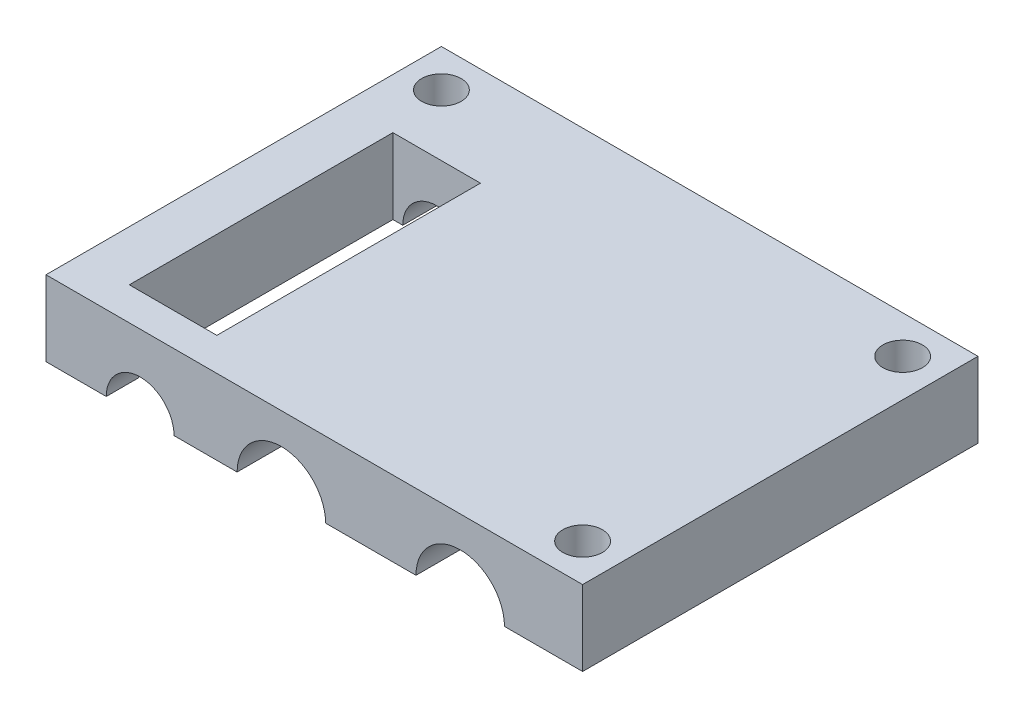
ISO-10303-21;
HEADER;
FILE_DESCRIPTION(('STEP AP214'),'2;1');
FILE_NAME('part.step','',(''),(''),'','','');
FILE_SCHEMA(('AUTOMOTIVE_DESIGN { 1 0 10303 214 1 1 1 1 }'));
ENDSEC;
DATA;
#1=APPLICATION_CONTEXT('core data for automotive mechanical design processes');
#2=APPLICATION_PROTOCOL_DEFINITION('international standard','automotive_design',2000,#1);
#3=PRODUCT_CONTEXT('',#1,'mechanical');
#4=PRODUCT('Part','Part','',(#3));
#5=PRODUCT_RELATED_PRODUCT_CATEGORY('part','',(#4));
#6=PRODUCT_DEFINITION_FORMATION('','',#4);
#7=PRODUCT_DEFINITION_CONTEXT('part definition',#1,'design');
#8=PRODUCT_DEFINITION('design','',#6,#7);
#9=PRODUCT_DEFINITION_SHAPE('','',#8);
#10=(LENGTH_UNIT() NAMED_UNIT(*) SI_UNIT(.MILLI.,.METRE.));
#11=(NAMED_UNIT(*) PLANE_ANGLE_UNIT() SI_UNIT($,.RADIAN.));
#12=(NAMED_UNIT(*) SI_UNIT($,.STERADIAN.) SOLID_ANGLE_UNIT());
#13=UNCERTAINTY_MEASURE_WITH_UNIT(LENGTH_MEASURE(1.E-05),#10,'distance_accuracy_value','');
#14=(GEOMETRIC_REPRESENTATION_CONTEXT(3) GLOBAL_UNCERTAINTY_ASSIGNED_CONTEXT((#13)) GLOBAL_UNIT_ASSIGNED_CONTEXT((#10,
#11,#12)) REPRESENTATION_CONTEXT('',''));
#15=CARTESIAN_POINT('',(0.,0.,0.));
#16=DIRECTION('',(0.,0.,1.));
#17=DIRECTION('',(1.,0.,0.));
#18=AXIS2_PLACEMENT_3D('',#15,#16,#17);
#19=CARTESIAN_POINT('',(-18.5,0.,-42.));
#20=DIRECTION('',(0.,0.,1.));
#21=DIRECTION('',(1.,0.,0.));
#22=AXIS2_PLACEMENT_3D('',#19,#20,#21);
#23=CYLINDRICAL_SURFACE('',#22,3.6);
#24=CARTESIAN_POINT('',(-18.5,0.,-39.));
#25=DIRECTION('',(0.,0.,-1.));
#26=DIRECTION('',(-1.,0.,0.));
#27=AXIS2_PLACEMENT_3D('',#24,#25,#26);
#28=CIRCLE('',#27,3.6);
#29=CARTESIAN_POINT('',(-14.9,0.,-39.));
#30=VERTEX_POINT('',#29);
#31=CARTESIAN_POINT('',(-22.1,0.,-39.));
#32=VERTEX_POINT('',#31);
#33=EDGE_CURVE('E221',#30,#32,#28,.F.);
#34=ORIENTED_EDGE('',*,*,#33,.F.);
#35=DIRECTION('',(0.,0.,1.));
#36=VECTOR('',#35,1.);
#37=CARTESIAN_POINT('',(-14.9,0.,-42.));
#38=LINE('',#37,#36);
#39=CARTESIAN_POINT('',(-14.9,0.,-31.5));
#40=VERTEX_POINT('',#39);
#41=EDGE_CURVE('E419',#30,#40,#38,.T.);
#42=ORIENTED_EDGE('',*,*,#41,.T.);
#43=CARTESIAN_POINT('',(-18.5,0.,-31.5));
#44=DIRECTION('',(0.,0.,-1.));
#45=DIRECTION('',(-1.,0.,0.));
#46=AXIS2_PLACEMENT_3D('',#43,#44,#45);
#47=CIRCLE('',#46,3.6);
#48=CARTESIAN_POINT('',(-22.1,0.,-31.5));
#49=VERTEX_POINT('',#48);
#50=EDGE_CURVE('E329',#40,#49,#47,.F.);
#51=ORIENTED_EDGE('',*,*,#50,.T.);
#52=DIRECTION('',(0.,0.,1.));
#53=VECTOR('',#52,1.);
#54=CARTESIAN_POINT('',(-22.1,0.,-42.));
#55=LINE('',#54,#53);
#56=EDGE_CURVE('E423',#32,#49,#55,.T.);
#57=ORIENTED_EDGE('',*,*,#56,.F.);
#58=EDGE_LOOP('',(#34,#42,#51,#57));
#59=FACE_BOUND('',#58,.T.);
#60=ADVANCED_FACE('F41',(#59),#23,.F.);
#61=CARTESIAN_POINT('',(-3.50000000000001,0.,-42.));
#62=DIRECTION('',(0.,0.,1.));
#63=DIRECTION('',(1.,0.,0.));
#64=AXIS2_PLACEMENT_3D('',#61,#62,#63);
#65=CYLINDRICAL_SURFACE('',#64,4.7);
#66=CARTESIAN_POINT('',(-3.50000000000001,0.,-39.));
#67=DIRECTION('',(0.,0.,-1.));
#68=DIRECTION('',(-1.,0.,0.));
#69=AXIS2_PLACEMENT_3D('',#66,#67,#68);
#70=CIRCLE('',#69,4.7);
#71=CARTESIAN_POINT('',(1.19999999999999,0.,-39.));
#72=VERTEX_POINT('',#71);
#73=CARTESIAN_POINT('',(-8.20000000000001,0.,-39.));
#74=VERTEX_POINT('',#73);
#75=EDGE_CURVE('E241',#72,#74,#70,.F.);
#76=ORIENTED_EDGE('',*,*,#75,.F.);
#77=DIRECTION('',(0.,0.,1.));
#78=VECTOR('',#77,1.);
#79=CARTESIAN_POINT('',(1.19999999999999,0.,-42.));
#80=LINE('',#79,#78);
#81=CARTESIAN_POINT('',(1.19999999999999,0.,0.));
#82=VERTEX_POINT('',#81);
#83=EDGE_CURVE('E51',#72,#82,#80,.T.);
#84=ORIENTED_EDGE('',*,*,#83,.T.);
#85=CARTESIAN_POINT('',(-3.50000000000001,0.,0.));
#86=DIRECTION('',(0.,0.,1.));
#87=DIRECTION('',(1.,0.,0.));
#88=AXIS2_PLACEMENT_3D('',#85,#86,#87);
#89=CIRCLE('',#88,4.7);
#90=CARTESIAN_POINT('',(-8.20000000000001,0.,0.));
#91=VERTEX_POINT('',#90);
#92=EDGE_CURVE('E407',#82,#91,#89,.T.);
#93=ORIENTED_EDGE('',*,*,#92,.T.);
#94=DIRECTION('',(0.,0.,1.));
#95=VECTOR('',#94,1.);
#96=CARTESIAN_POINT('',(-8.20000000000001,0.,-42.));
#97=LINE('',#96,#95);
#98=EDGE_CURVE('E416',#74,#91,#97,.T.);
#99=ORIENTED_EDGE('',*,*,#98,.F.);
#100=EDGE_LOOP('',(#76,#84,#93,#99));
#101=FACE_BOUND('',#100,.T.);
#102=ADVANCED_FACE('F505',(#101),#65,.F.);
#103=CARTESIAN_POINT('',(15.5,0.,-42.));
#104=DIRECTION('',(0.,0.,1.));
#105=DIRECTION('',(1.,0.,0.));
#106=AXIS2_PLACEMENT_3D('',#103,#104,#105);
#107=CYLINDRICAL_SURFACE('',#106,4.7);
#108=CARTESIAN_POINT('',(15.5,0.,-39.));
#109=DIRECTION('',(0.,0.,-1.));
#110=DIRECTION('',(-1.,0.,0.));
#111=AXIS2_PLACEMENT_3D('',#108,#109,#110);
#112=CIRCLE('',#111,4.7);
#113=CARTESIAN_POINT('',(20.2,0.,-39.));
#114=VERTEX_POINT('',#113);
#115=CARTESIAN_POINT('',(10.8,0.,-39.));
#116=VERTEX_POINT('',#115);
#117=EDGE_CURVE('E267',#114,#116,#112,.F.);
#118=ORIENTED_EDGE('',*,*,#117,.F.);
#119=DIRECTION('',(0.,0.,1.));
#120=VECTOR('',#119,1.);
#121=CARTESIAN_POINT('',(20.2,0.,-42.));
#122=LINE('',#121,#120);
#123=CARTESIAN_POINT('',(20.2,0.,0.));
#124=VERTEX_POINT('',#123);
#125=EDGE_CURVE('E376',#114,#124,#122,.T.);
#126=ORIENTED_EDGE('',*,*,#125,.T.);
#127=CARTESIAN_POINT('',(15.5,0.,0.));
#128=DIRECTION('',(0.,0.,1.));
#129=DIRECTION('',(1.,0.,0.));
#130=AXIS2_PLACEMENT_3D('',#127,#128,#129);
#131=CIRCLE('',#130,4.7);
#132=CARTESIAN_POINT('',(10.8,0.,0.));
#133=VERTEX_POINT('',#132);
#134=EDGE_CURVE('E352',#124,#133,#131,.T.);
#135=ORIENTED_EDGE('',*,*,#134,.T.);
#136=DIRECTION('',(0.,0.,1.));
#137=VECTOR('',#136,1.);
#138=CARTESIAN_POINT('',(10.8,0.,-42.));
#139=LINE('',#138,#137);
#140=EDGE_CURVE('E11',#116,#133,#139,.T.);
#141=ORIENTED_EDGE('',*,*,#140,.F.);
#142=EDGE_LOOP('',(#118,#126,#135,#141));
#143=FACE_BOUND('',#142,.T.);
#144=ADVANCED_FACE('F43',(#143),#107,.F.);
#145=CARTESIAN_POINT('',(-22.1,0.,-3.5));
#146=VERTEX_POINT('',#145);
#147=CARTESIAN_POINT('',(-22.1,0.,0.));
#148=VERTEX_POINT('',#147);
#149=EDGE_CURVE('E426',#146,#148,#55,.T.);
#150=ORIENTED_EDGE('',*,*,#149,.F.);
#151=CARTESIAN_POINT('',(-18.5,0.,-3.5));
#152=DIRECTION('',(0.,0.,1.));
#153=DIRECTION('',(1.,0.,0.));
#154=AXIS2_PLACEMENT_3D('',#151,#152,#153);
#155=CIRCLE('',#154,3.6);
#156=CARTESIAN_POINT('',(-14.9,0.,-3.5));
#157=VERTEX_POINT('',#156);
#158=EDGE_CURVE('E342',#146,#157,#155,.F.);
#159=ORIENTED_EDGE('',*,*,#158,.T.);
#160=CARTESIAN_POINT('',(-14.9,0.,0.));
#161=VERTEX_POINT('',#160);
#162=EDGE_CURVE('E422',#157,#161,#38,.T.);
#163=ORIENTED_EDGE('',*,*,#162,.T.);
#164=CARTESIAN_POINT('',(-18.5,0.,0.));
#165=DIRECTION('',(0.,0.,1.));
#166=DIRECTION('',(1.,0.,0.));
#167=AXIS2_PLACEMENT_3D('',#164,#165,#166);
#168=CIRCLE('',#167,3.6);
#169=EDGE_CURVE('E399',#161,#148,#168,.T.);
#170=ORIENTED_EDGE('',*,*,#169,.T.);
#171=EDGE_LOOP('',(#150,#159,#163,#170));
#172=FACE_BOUND('',#171,.T.);
#173=ADVANCED_FACE('F533',(#172),#23,.F.);
#174=CARTESIAN_POINT('',(0.,0.,-42.));
#175=DIRECTION('',(0.,-1.,0.));
#176=DIRECTION('',(0.,0.,-1.));
#177=AXIS2_PLACEMENT_3D('',#174,#175,#176);
#178=PLANE('',#177);
#179=DIRECTION('',(1.,0.,0.));
#180=VECTOR('',#179,1.);
#181=CARTESIAN_POINT('',(0.,0.,0.));
#182=LINE('',#181,#180);
#183=EDGE_CURVE('E358',#82,#133,#182,.T.);
#184=ORIENTED_EDGE('',*,*,#183,.F.);
#185=ORIENTED_EDGE('',*,*,#83,.F.);
#186=DIRECTION('',(-1.,0.,0.));
#187=VECTOR('',#186,1.);
#188=CARTESIAN_POINT('',(0.,0.,-39.));
#189=LINE('',#188,#187);
#190=CARTESIAN_POINT('',(-2.00000000000001,0.,-39.));
#191=VERTEX_POINT('',#190);
#192=EDGE_CURVE('E244',#72,#191,#189,.T.);
#193=ORIENTED_EDGE('',*,*,#192,.T.);
#194=DIRECTION('',(0.,0.,-1.));
#195=VECTOR('',#194,1.);
#196=CARTESIAN_POINT('',(-2.00000000000001,0.,-39.));
#197=LINE('',#196,#195);
#198=CARTESIAN_POINT('',(-2.00000000000001,0.,-42.));
#199=VERTEX_POINT('',#198);
#200=EDGE_CURVE('E252',#191,#199,#197,.T.);
#201=ORIENTED_EDGE('',*,*,#200,.T.);
#202=DIRECTION('',(1.,0.,0.));
#203=VECTOR('',#202,1.);
#204=CARTESIAN_POINT('',(0.,0.,-42.));
#205=LINE('',#204,#203);
#206=CARTESIAN_POINT('',(14.,0.,-42.));
#207=VERTEX_POINT('',#206);
#208=EDGE_CURVE('E373',#199,#207,#205,.T.);
#209=ORIENTED_EDGE('',*,*,#208,.T.);
#210=DIRECTION('',(0.,0.,-1.));
#211=VECTOR('',#210,1.);
#212=CARTESIAN_POINT('',(14.,0.,-39.));
#213=LINE('',#212,#211);
#214=CARTESIAN_POINT('',(14.,0.,-39.));
#215=VERTEX_POINT('',#214);
#216=EDGE_CURVE('E274',#215,#207,#213,.T.);
#217=ORIENTED_EDGE('',*,*,#216,.F.);
#218=DIRECTION('',(-1.,0.,0.));
#219=VECTOR('',#218,1.);
#220=CARTESIAN_POINT('',(0.,0.,-39.));
#221=LINE('',#220,#219);
#222=EDGE_CURVE('E263',#215,#116,#221,.T.);
#223=ORIENTED_EDGE('',*,*,#222,.T.);
#224=ORIENTED_EDGE('',*,*,#140,.T.);
#225=EDGE_LOOP('',(#184,#185,#193,#201,#209,#217,#223,#224));
#226=FACE_BOUND('',#225,.T.);
#227=ADVANCED_FACE('F475',(#226),#178,.T.);
#228=CARTESIAN_POINT('',(0.,0.,-42.));
#229=DIRECTION('',(0.,-1.,0.));
#230=DIRECTION('',(0.,0.,-1.));
#231=AXIS2_PLACEMENT_3D('',#228,#229,#230);
#232=PLANE('',#231);
#233=DIRECTION('',(-1.,0.,0.));
#234=VECTOR('',#233,1.);
#235=CARTESIAN_POINT('',(0.,0.,-3.5));
#236=LINE('',#235,#234);
#237=CARTESIAN_POINT('',(-13.85,0.,-3.5));
#238=VERTEX_POINT('',#237);
#239=EDGE_CURVE('E346',#238,#157,#236,.T.);
#240=ORIENTED_EDGE('',*,*,#239,.F.);
#241=DIRECTION('',(0.,0.,1.));
#242=VECTOR('',#241,1.);
#243=CARTESIAN_POINT('',(-13.85,0.,-42.));
#244=LINE('',#243,#242);
#245=CARTESIAN_POINT('',(-13.85,0.,-31.5));
#246=VERTEX_POINT('',#245);
#247=EDGE_CURVE('E349',#246,#238,#244,.T.);
#248=ORIENTED_EDGE('',*,*,#247,.F.);
#249=DIRECTION('',(1.,0.,0.));
#250=VECTOR('',#249,1.);
#251=CARTESIAN_POINT('',(0.,0.,-31.5));
#252=LINE('',#251,#250);
#253=EDGE_CURVE('E333',#40,#246,#252,.T.);
#254=ORIENTED_EDGE('',*,*,#253,.F.);
#255=ORIENTED_EDGE('',*,*,#41,.F.);
#256=DIRECTION('',(-1.,0.,0.));
#257=VECTOR('',#256,1.);
#258=CARTESIAN_POINT('',(0.,0.,-39.));
#259=LINE('',#258,#257);
#260=CARTESIAN_POINT('',(-16.5,0.,-39.));
#261=VERTEX_POINT('',#260);
#262=EDGE_CURVE('E208',#30,#261,#259,.T.);
#263=ORIENTED_EDGE('',*,*,#262,.T.);
#264=DIRECTION('',(0.,0.,-1.));
#265=VECTOR('',#264,1.);
#266=CARTESIAN_POINT('',(-16.5,0.,-39.));
#267=LINE('',#266,#265);
#268=CARTESIAN_POINT('',(-16.5,0.,-42.));
#269=VERTEX_POINT('',#268);
#270=EDGE_CURVE('E207',#261,#269,#267,.T.);
#271=ORIENTED_EDGE('',*,*,#270,.T.);
#272=DIRECTION('',(1.,0.,0.));
#273=VECTOR('',#272,1.);
#274=CARTESIAN_POINT('',(0.,0.,-42.));
#275=LINE('',#274,#273);
#276=CARTESIAN_POINT('',(-5.00000000000001,0.,-42.));
#277=VERTEX_POINT('',#276);
#278=EDGE_CURVE('E370',#269,#277,#275,.T.);
#279=ORIENTED_EDGE('',*,*,#278,.T.);
#280=DIRECTION('',(0.,0.,-1.));
#281=VECTOR('',#280,1.);
#282=CARTESIAN_POINT('',(-5.00000000000001,0.,-39.));
#283=LINE('',#282,#281);
#284=CARTESIAN_POINT('',(-5.00000000000001,0.,-39.));
#285=VERTEX_POINT('',#284);
#286=EDGE_CURVE('E248',#285,#277,#283,.T.);
#287=ORIENTED_EDGE('',*,*,#286,.F.);
#288=DIRECTION('',(-1.,0.,0.));
#289=VECTOR('',#288,1.);
#290=CARTESIAN_POINT('',(0.,0.,-39.));
#291=LINE('',#290,#289);
#292=EDGE_CURVE('E237',#285,#74,#291,.T.);
#293=ORIENTED_EDGE('',*,*,#292,.T.);
#294=ORIENTED_EDGE('',*,*,#98,.T.);
#295=DIRECTION('',(1.,0.,0.));
#296=VECTOR('',#295,1.);
#297=CARTESIAN_POINT('',(0.,0.,0.));
#298=LINE('',#297,#296);
#299=EDGE_CURVE('E403',#161,#91,#298,.T.);
#300=ORIENTED_EDGE('',*,*,#299,.F.);
#301=ORIENTED_EDGE('',*,*,#162,.F.);
#302=EDGE_LOOP('',(#240,#248,#254,#255,#263,#271,#279,#287,#293,#294,#300,#301));
#303=FACE_BOUND('',#302,.T.);
#304=ADVANCED_FACE('F500',(#303),#232,.T.);
#305=CARTESIAN_POINT('',(0.,0.,-42.));
#306=DIRECTION('',(0.,-1.,0.));
#307=DIRECTION('',(1.,0.,0.));
#308=AXIS2_PLACEMENT_3D('',#305,#306,#307);
#309=PLANE('',#308);
#310=CARTESIAN_POINT('',(-24.5,0.,-38.));
#311=DIRECTION('',(0.,-1.,0.));
#312=DIRECTION('',(1.,0.,0.));
#313=AXIS2_PLACEMENT_3D('',#310,#311,#312);
#314=CIRCLE('',#313,2.1);
#315=CARTESIAN_POINT('',(-22.4,0.,-38.));
#316=VERTEX_POINT('',#315);
#317=EDGE_CURVE('E298',#316,#316,#314,.T.);
#318=ORIENTED_EDGE('',*,*,#317,.F.);
#319=EDGE_LOOP('',(#318));
#320=FACE_BOUND('',#319,.T.);
#321=DIRECTION('',(-1.,0.,0.));
#322=VECTOR('',#321,1.);
#323=CARTESIAN_POINT('',(0.,0.,-3.5));
#324=LINE('',#323,#322);
#325=CARTESIAN_POINT('',(-23.15,0.,-3.5));
#326=VERTEX_POINT('',#325);
#327=EDGE_CURVE('E339',#146,#326,#324,.T.);
#328=ORIENTED_EDGE('',*,*,#327,.F.);
#329=ORIENTED_EDGE('',*,*,#149,.T.);
#330=DIRECTION('',(1.,0.,0.));
#331=VECTOR('',#330,1.);
#332=CARTESIAN_POINT('',(0.,0.,0.));
#333=LINE('',#332,#331);
#334=CARTESIAN_POINT('',(-28.5,0.,0.));
#335=VERTEX_POINT('',#334);
#336=EDGE_CURVE('E395',#335,#148,#333,.T.);
#337=ORIENTED_EDGE('',*,*,#336,.F.);
#338=DIRECTION('',(0.,0.,1.));
#339=VECTOR('',#338,1.);
#340=CARTESIAN_POINT('',(-28.5,0.,-42.));
#341=LINE('',#340,#339);
#342=CARTESIAN_POINT('',(-28.5,0.,-42.));
#343=VERTEX_POINT('',#342);
#344=EDGE_CURVE('E427',#343,#335,#341,.T.);
#345=ORIENTED_EDGE('',*,*,#344,.F.);
#346=DIRECTION('',(1.,0.,0.));
#347=VECTOR('',#346,1.);
#348=CARTESIAN_POINT('',(0.,0.,-42.));
#349=LINE('',#348,#347);
#350=CARTESIAN_POINT('',(-20.5,0.,-42.));
#351=VERTEX_POINT('',#350);
#352=EDGE_CURVE('E202',#343,#351,#349,.T.);
#353=ORIENTED_EDGE('',*,*,#352,.T.);
#354=DIRECTION('',(0.,0.,-1.));
#355=VECTOR('',#354,1.);
#356=CARTESIAN_POINT('',(-20.5,0.,-39.));
#357=LINE('',#356,#355);
#358=CARTESIAN_POINT('',(-20.5,0.,-39.));
#359=VERTEX_POINT('',#358);
#360=EDGE_CURVE('E194',#359,#351,#357,.T.);
#361=ORIENTED_EDGE('',*,*,#360,.F.);
#362=DIRECTION('',(-1.,0.,0.));
#363=VECTOR('',#362,1.);
#364=CARTESIAN_POINT('',(0.,0.,-39.));
#365=LINE('',#364,#363);
#366=EDGE_CURVE('E199',#359,#32,#365,.T.);
#367=ORIENTED_EDGE('',*,*,#366,.T.);
#368=ORIENTED_EDGE('',*,*,#56,.T.);
#369=DIRECTION('',(1.,0.,0.));
#370=VECTOR('',#369,1.);
#371=CARTESIAN_POINT('',(0.,0.,-31.5));
#372=LINE('',#371,#370);
#373=CARTESIAN_POINT('',(-23.15,0.,-31.5));
#374=VERTEX_POINT('',#373);
#375=EDGE_CURVE('E319',#374,#49,#372,.T.);
#376=ORIENTED_EDGE('',*,*,#375,.F.);
#377=DIRECTION('',(0.,0.,-1.));
#378=VECTOR('',#377,1.);
#379=CARTESIAN_POINT('',(-23.15,0.,-42.));
#380=LINE('',#379,#378);
#381=EDGE_CURVE('E336',#326,#374,#380,.T.);
#382=ORIENTED_EDGE('',*,*,#381,.F.);
#383=EDGE_LOOP('',(#328,#329,#337,#345,#353,#361,#367,#368,#376,#382));
#384=FACE_BOUND('',#383,.T.);
#385=ADVANCED_FACE('F197',(#320,#384),#309,.T.);
#386=CARTESIAN_POINT('',(-28.5,0.,-42.));
#387=DIRECTION('',(-1.,0.,0.));
#388=DIRECTION('',(0.,-1.,0.));
#389=AXIS2_PLACEMENT_3D('',#386,#387,#388);
#390=PLANE('',#389);
#391=DIRECTION('',(0.,-1.,0.));
#392=VECTOR('',#391,1.);
#393=CARTESIAN_POINT('',(-28.5,0.,0.));
#394=LINE('',#393,#392);
#395=CARTESIAN_POINT('',(-28.5,8.00000000000001,0.));
#396=VERTEX_POINT('',#395);
#397=EDGE_CURVE('E391',#396,#335,#394,.T.);
#398=ORIENTED_EDGE('',*,*,#397,.F.);
#399=DIRECTION('',(0.,0.,1.));
#400=VECTOR('',#399,1.);
#401=CARTESIAN_POINT('',(-28.5,8.00000000000001,-42.));
#402=LINE('',#401,#400);
#403=CARTESIAN_POINT('',(-28.5,8.00000000000001,-42.));
#404=VERTEX_POINT('',#403);
#405=EDGE_CURVE('E430',#404,#396,#402,.T.);
#406=ORIENTED_EDGE('',*,*,#405,.F.);
#407=DIRECTION('',(0.,-1.,0.));
#408=VECTOR('',#407,1.);
#409=CARTESIAN_POINT('',(-28.5,0.,-42.));
#410=LINE('',#409,#408);
#411=EDGE_CURVE('E364',#404,#343,#410,.T.);
#412=ORIENTED_EDGE('',*,*,#411,.T.);
#413=ORIENTED_EDGE('',*,*,#344,.T.);
#414=EDGE_LOOP('',(#398,#406,#412,#413));
#415=FACE_BOUND('',#414,.T.);
#416=ADVANCED_FACE('F491',(#415),#390,.T.);
#417=CARTESIAN_POINT('',(0.,8.00000000000001,-42.));
#418=DIRECTION('',(0.,-1.,0.));
#419=DIRECTION('',(0.,0.,-1.));
#420=AXIS2_PLACEMENT_3D('',#417,#418,#419);
#421=PLANE('',#420);
#422=CARTESIAN_POINT('',(-24.5,8.00000000000001,-38.));
#423=DIRECTION('',(0.,1.,0.));
#424=DIRECTION('',(0.,0.,1.));
#425=AXIS2_PLACEMENT_3D('',#422,#423,#424);
#426=CIRCLE('',#425,2.1);
#427=CARTESIAN_POINT('',(-24.5,8.00000000000001,-35.9));
#428=VERTEX_POINT('',#427);
#429=EDGE_CURVE('E286',#428,#428,#426,.T.);
#430=ORIENTED_EDGE('',*,*,#429,.F.);
#431=EDGE_LOOP('',(#430));
#432=FACE_BOUND('',#431,.T.);
#433=CARTESIAN_POINT('',(24.5,8.00000000000001,-38.));
#434=DIRECTION('',(0.,1.,0.));
#435=DIRECTION('',(0.,0.,1.));
#436=AXIS2_PLACEMENT_3D('',#433,#434,#435);
#437=CIRCLE('',#436,2.1);
#438=CARTESIAN_POINT('',(24.5,8.00000000000001,-35.9));
#439=VERTEX_POINT('',#438);
#440=EDGE_CURVE('E291',#439,#439,#437,.T.);
#441=ORIENTED_EDGE('',*,*,#440,.F.);
#442=EDGE_LOOP('',(#441));
#443=FACE_BOUND('',#442,.T.);
#444=CARTESIAN_POINT('',(24.5,8.00000000000001,-4.));
#445=DIRECTION('',(0.,1.,0.));
#446=DIRECTION('',(0.,0.,1.));
#447=AXIS2_PLACEMENT_3D('',#444,#445,#446);
#448=CIRCLE('',#447,2.1);
#449=CARTESIAN_POINT('',(24.5,8.00000000000001,-1.9));
#450=VERTEX_POINT('',#449);
#451=EDGE_CURVE('E282',#450,#450,#448,.T.);
#452=ORIENTED_EDGE('',*,*,#451,.F.);
#453=EDGE_LOOP('',(#452));
#454=FACE_BOUND('',#453,.T.);
#455=DIRECTION('',(-1.,0.,0.));
#456=VECTOR('',#455,1.);
#457=CARTESIAN_POINT('',(-23.15,8.00000000000001,-31.5));
#458=LINE('',#457,#456);
#459=CARTESIAN_POINT('',(-13.85,8.00000000000001,-31.5));
#460=VERTEX_POINT('',#459);
#461=CARTESIAN_POINT('',(-23.15,8.00000000000001,-31.5));
#462=VERTEX_POINT('',#461);
#463=EDGE_CURVE('E304',#460,#462,#458,.T.);
#464=ORIENTED_EDGE('',*,*,#463,.F.);
#465=DIRECTION('',(0.,0.,-1.));
#466=VECTOR('',#465,1.);
#467=CARTESIAN_POINT('',(-13.85,8.00000000000001,-31.5));
#468=LINE('',#467,#466);
#469=CARTESIAN_POINT('',(-13.85,8.00000000000001,-3.5));
#470=VERTEX_POINT('',#469);
#471=EDGE_CURVE('E67',#470,#460,#468,.T.);
#472=ORIENTED_EDGE('',*,*,#471,.F.);
#473=DIRECTION('',(1.,0.,0.));
#474=VECTOR('',#473,1.);
#475=CARTESIAN_POINT('',(-23.15,8.00000000000001,-3.5));
#476=LINE('',#475,#474);
#477=CARTESIAN_POINT('',(-23.15,8.00000000000001,-3.5));
#478=VERTEX_POINT('',#477);
#479=EDGE_CURVE('E311',#478,#470,#476,.T.);
#480=ORIENTED_EDGE('',*,*,#479,.F.);
#481=DIRECTION('',(0.,0.,1.));
#482=VECTOR('',#481,1.);
#483=CARTESIAN_POINT('',(-23.15,8.00000000000001,-31.5));
#484=LINE('',#483,#482);
#485=EDGE_CURVE('E307',#462,#478,#484,.T.);
#486=ORIENTED_EDGE('',*,*,#485,.F.);
#487=EDGE_LOOP('',(#464,#472,#480,#486));
#488=FACE_BOUND('',#487,.T.);
#489=DIRECTION('',(1.,0.,0.));
#490=VECTOR('',#489,1.);
#491=CARTESIAN_POINT('',(0.,8.00000000000001,0.));
#492=LINE('',#491,#490);
#493=CARTESIAN_POINT('',(28.5,8.00000000000001,0.));
#494=VERTEX_POINT('',#493);
#495=EDGE_CURVE('E388',#396,#494,#492,.T.);
#496=ORIENTED_EDGE('',*,*,#495,.T.);
#497=DIRECTION('',(0.,0.,1.));
#498=VECTOR('',#497,1.);
#499=CARTESIAN_POINT('',(28.5,8.00000000000001,-42.));
#500=LINE('',#499,#498);
#501=CARTESIAN_POINT('',(28.5,8.00000000000001,-42.));
#502=VERTEX_POINT('',#501);
#503=EDGE_CURVE('E433',#502,#494,#500,.T.);
#504=ORIENTED_EDGE('',*,*,#503,.F.);
#505=DIRECTION('',(1.,0.,0.));
#506=VECTOR('',#505,1.);
#507=CARTESIAN_POINT('',(0.,8.00000000000001,-42.));
#508=LINE('',#507,#506);
#509=EDGE_CURVE('E361',#404,#502,#508,.T.);
#510=ORIENTED_EDGE('',*,*,#509,.F.);
#511=ORIENTED_EDGE('',*,*,#405,.T.);
#512=EDGE_LOOP('',(#496,#504,#510,#511));
#513=FACE_BOUND('',#512,.T.);
#514=ADVANCED_FACE('F488',(#432,#443,#454,#488,#513),#421,.F.);
#515=CARTESIAN_POINT('',(28.5,0.,-42.));
#516=DIRECTION('',(-1.,0.,0.));
#517=DIRECTION('',(0.,0.,1.));
#518=AXIS2_PLACEMENT_3D('',#515,#516,#517);
#519=PLANE('',#518);
#520=DIRECTION('',(0.,-1.,0.));
#521=VECTOR('',#520,1.);
#522=CARTESIAN_POINT('',(28.5,0.,0.));
#523=LINE('',#522,#521);
#524=CARTESIAN_POINT('',(28.5,0.,0.));
#525=VERTEX_POINT('',#524);
#526=EDGE_CURVE('E384',#494,#525,#523,.T.);
#527=ORIENTED_EDGE('',*,*,#526,.T.);
#528=DIRECTION('',(0.,0.,1.));
#529=VECTOR('',#528,1.);
#530=CARTESIAN_POINT('',(28.5,0.,-42.));
#531=LINE('',#530,#529);
#532=CARTESIAN_POINT('',(28.5,0.,-42.));
#533=VERTEX_POINT('',#532);
#534=EDGE_CURVE('E437',#533,#525,#531,.T.);
#535=ORIENTED_EDGE('',*,*,#534,.F.);
#536=DIRECTION('',(0.,-1.,0.));
#537=VECTOR('',#536,1.);
#538=CARTESIAN_POINT('',(28.5,0.,-42.));
#539=LINE('',#538,#537);
#540=EDGE_CURVE('E357',#502,#533,#539,.T.);
#541=ORIENTED_EDGE('',*,*,#540,.F.);
#542=ORIENTED_EDGE('',*,*,#503,.T.);
#543=EDGE_LOOP('',(#527,#535,#541,#542));
#544=FACE_BOUND('',#543,.T.);
#545=ADVANCED_FACE('F456',(#544),#519,.F.);
#546=CARTESIAN_POINT('',(0.,0.,-42.));
#547=DIRECTION('',(0.,-1.,0.));
#548=DIRECTION('',(1.,0.,0.));
#549=AXIS2_PLACEMENT_3D('',#546,#547,#548);
#550=PLANE('',#549);
#551=CARTESIAN_POINT('',(24.5,0.,-38.));
#552=DIRECTION('',(0.,-1.,0.));
#553=DIRECTION('',(1.,0.,0.));
#554=AXIS2_PLACEMENT_3D('',#551,#552,#553);
#555=CIRCLE('',#554,2.1);
#556=CARTESIAN_POINT('',(26.6,0.,-38.));
#557=VERTEX_POINT('',#556);
#558=EDGE_CURVE('E45',#557,#557,#555,.T.);
#559=ORIENTED_EDGE('',*,*,#558,.F.);
#560=EDGE_LOOP('',(#559));
#561=FACE_BOUND('',#560,.T.);
#562=CARTESIAN_POINT('',(24.5,0.,-4.));
#563=DIRECTION('',(0.,-1.,0.));
#564=DIRECTION('',(1.,0.,0.));
#565=AXIS2_PLACEMENT_3D('',#562,#563,#564);
#566=CIRCLE('',#565,2.1);
#567=CARTESIAN_POINT('',(26.6,0.,-4.));
#568=VERTEX_POINT('',#567);
#569=EDGE_CURVE('E290',#568,#568,#566,.T.);
#570=ORIENTED_EDGE('',*,*,#569,.F.);
#571=EDGE_LOOP('',(#570));
#572=FACE_BOUND('',#571,.T.);
#573=DIRECTION('',(1.,0.,0.));
#574=VECTOR('',#573,1.);
#575=CARTESIAN_POINT('',(0.,0.,0.));
#576=LINE('',#575,#574);
#577=EDGE_CURVE('E380',#124,#525,#576,.T.);
#578=ORIENTED_EDGE('',*,*,#577,.F.);
#579=ORIENTED_EDGE('',*,*,#125,.F.);
#580=DIRECTION('',(-1.,0.,0.));
#581=VECTOR('',#580,1.);
#582=CARTESIAN_POINT('',(0.,0.,-39.));
#583=LINE('',#582,#581);
#584=CARTESIAN_POINT('',(17.,0.,-39.));
#585=VERTEX_POINT('',#584);
#586=EDGE_CURVE('E270',#114,#585,#583,.T.);
#587=ORIENTED_EDGE('',*,*,#586,.T.);
#588=DIRECTION('',(0.,0.,-1.));
#589=VECTOR('',#588,1.);
#590=CARTESIAN_POINT('',(17.,0.,-39.));
#591=LINE('',#590,#589);
#592=CARTESIAN_POINT('',(17.,0.,-42.));
#593=VERTEX_POINT('',#592);
#594=EDGE_CURVE('E278',#585,#593,#591,.T.);
#595=ORIENTED_EDGE('',*,*,#594,.T.);
#596=DIRECTION('',(1.,0.,0.));
#597=VECTOR('',#596,1.);
#598=CARTESIAN_POINT('',(0.,0.,-42.));
#599=LINE('',#598,#597);
#600=EDGE_CURVE('E353',#593,#533,#599,.T.);
#601=ORIENTED_EDGE('',*,*,#600,.T.);
#602=ORIENTED_EDGE('',*,*,#534,.T.);
#603=EDGE_LOOP('',(#578,#579,#587,#595,#601,#602));
#604=FACE_BOUND('',#603,.T.);
#605=ADVANCED_FACE('F452',(#561,#572,#604),#550,.T.);
#606=CARTESIAN_POINT('',(0.,0.,-42.));
#607=DIRECTION('',(0.,0.,1.));
#608=DIRECTION('',(1.,0.,0.));
#609=AXIS2_PLACEMENT_3D('',#606,#607,#608);
#610=PLANE('',#609);
#611=ORIENTED_EDGE('',*,*,#600,.F.);
#612=CARTESIAN_POINT('',(15.5,0.,-42.));
#613=DIRECTION('',(0.,0.,-1.));
#614=DIRECTION('',(-1.,0.,0.));
#615=AXIS2_PLACEMENT_3D('',#612,#613,#614);
#616=CIRCLE('',#615,1.5);
#617=EDGE_CURVE('E256',#207,#593,#616,.T.);
#618=ORIENTED_EDGE('',*,*,#617,.F.);
#619=ORIENTED_EDGE('',*,*,#208,.F.);
#620=CARTESIAN_POINT('',(-3.50000000000001,0.,-42.));
#621=DIRECTION('',(0.,0.,-1.));
#622=DIRECTION('',(-1.,0.,0.));
#623=AXIS2_PLACEMENT_3D('',#620,#621,#622);
#624=CIRCLE('',#623,1.5);
#625=EDGE_CURVE('E232',#277,#199,#624,.T.);
#626=ORIENTED_EDGE('',*,*,#625,.F.);
#627=ORIENTED_EDGE('',*,*,#278,.F.);
#628=CARTESIAN_POINT('',(-18.5,0.,-42.));
#629=DIRECTION('',(0.,0.,-1.));
#630=DIRECTION('',(-1.,0.,0.));
#631=AXIS2_PLACEMENT_3D('',#628,#629,#630);
#632=CIRCLE('',#631,2.);
#633=EDGE_CURVE('E217',#351,#269,#632,.T.);
#634=ORIENTED_EDGE('',*,*,#633,.F.);
#635=ORIENTED_EDGE('',*,*,#352,.F.);
#636=ORIENTED_EDGE('',*,*,#411,.F.);
#637=ORIENTED_EDGE('',*,*,#509,.T.);
#638=ORIENTED_EDGE('',*,*,#540,.T.);
#639=EDGE_LOOP('',(#611,#618,#619,#626,#627,#634,#635,#636,#637,#638));
#640=FACE_BOUND('',#639,.T.);
#641=ADVANCED_FACE('F455',(#640),#610,.F.);
#642=CARTESIAN_POINT('',(0.,0.,0.));
#643=DIRECTION('',(0.,0.,1.));
#644=DIRECTION('',(1.,0.,0.));
#645=AXIS2_PLACEMENT_3D('',#642,#643,#644);
#646=PLANE('',#645);
#647=ORIENTED_EDGE('',*,*,#134,.F.);
#648=ORIENTED_EDGE('',*,*,#577,.T.);
#649=ORIENTED_EDGE('',*,*,#526,.F.);
#650=ORIENTED_EDGE('',*,*,#495,.F.);
#651=ORIENTED_EDGE('',*,*,#397,.T.);
#652=ORIENTED_EDGE('',*,*,#336,.T.);
#653=ORIENTED_EDGE('',*,*,#169,.F.);
#654=ORIENTED_EDGE('',*,*,#299,.T.);
#655=ORIENTED_EDGE('',*,*,#92,.F.);
#656=ORIENTED_EDGE('',*,*,#183,.T.);
#657=EDGE_LOOP('',(#647,#648,#649,#650,#651,#652,#653,#654,#655,#656));
#658=FACE_BOUND('',#657,.T.);
#659=ADVANCED_FACE('F464',(#658),#646,.T.);
#660=CARTESIAN_POINT('',(-13.85,-42.,-31.5));
#661=DIRECTION('',(1.,0.,0.));
#662=DIRECTION('',(0.,0.,-1.));
#663=AXIS2_PLACEMENT_3D('',#660,#661,#662);
#664=PLANE('',#663);
#665=ORIENTED_EDGE('',*,*,#247,.T.);
#666=DIRECTION('',(0.,1.,0.));
#667=VECTOR('',#666,1.);
#668=CARTESIAN_POINT('',(-13.85,-42.,-3.5));
#669=LINE('',#668,#667);
#670=EDGE_CURVE('E316',#238,#470,#669,.T.);
#671=ORIENTED_EDGE('',*,*,#670,.T.);
#672=ORIENTED_EDGE('',*,*,#471,.T.);
#673=DIRECTION('',(0.,1.,0.));
#674=VECTOR('',#673,1.);
#675=CARTESIAN_POINT('',(-13.85,-42.,-31.5));
#676=LINE('',#675,#674);
#677=EDGE_CURVE('E315',#246,#460,#676,.T.);
#678=ORIENTED_EDGE('',*,*,#677,.F.);
#679=EDGE_LOOP('',(#665,#671,#672,#678));
#680=FACE_BOUND('',#679,.T.);
#681=ADVANCED_FACE('F523',(#680),#664,.F.);
#682=CARTESIAN_POINT('',(-23.15,-42.,-3.5));
#683=DIRECTION('',(0.,0.,1.));
#684=DIRECTION('',(1.,0.,0.));
#685=AXIS2_PLACEMENT_3D('',#682,#683,#684);
#686=PLANE('',#685);
#687=ORIENTED_EDGE('',*,*,#239,.T.);
#688=ORIENTED_EDGE('',*,*,#158,.F.);
#689=ORIENTED_EDGE('',*,*,#327,.T.);
#690=DIRECTION('',(0.,1.,0.));
#691=VECTOR('',#690,1.);
#692=CARTESIAN_POINT('',(-23.15,-42.,-3.5));
#693=LINE('',#692,#691);
#694=EDGE_CURVE('E320',#326,#478,#693,.T.);
#695=ORIENTED_EDGE('',*,*,#694,.T.);
#696=ORIENTED_EDGE('',*,*,#479,.T.);
#697=ORIENTED_EDGE('',*,*,#670,.F.);
#698=EDGE_LOOP('',(#687,#688,#689,#695,#696,#697));
#699=FACE_BOUND('',#698,.T.);
#700=ADVANCED_FACE('F525',(#699),#686,.F.);
#701=CARTESIAN_POINT('',(-23.15,-42.,-31.5));
#702=DIRECTION('',(-1.,0.,0.));
#703=DIRECTION('',(0.,0.,1.));
#704=AXIS2_PLACEMENT_3D('',#701,#702,#703);
#705=PLANE('',#704);
#706=ORIENTED_EDGE('',*,*,#381,.T.);
#707=DIRECTION('',(0.,1.,0.));
#708=VECTOR('',#707,1.);
#709=CARTESIAN_POINT('',(-23.15,-42.,-31.5));
#710=LINE('',#709,#708);
#711=EDGE_CURVE('E59',#374,#462,#710,.T.);
#712=ORIENTED_EDGE('',*,*,#711,.T.);
#713=ORIENTED_EDGE('',*,*,#485,.T.);
#714=ORIENTED_EDGE('',*,*,#694,.F.);
#715=EDGE_LOOP('',(#706,#712,#713,#714));
#716=FACE_BOUND('',#715,.T.);
#717=ADVANCED_FACE('F532',(#716),#705,.F.);
#718=CARTESIAN_POINT('',(-23.15,-42.,-31.5));
#719=DIRECTION('',(0.,0.,-1.));
#720=DIRECTION('',(-1.,0.,0.));
#721=AXIS2_PLACEMENT_3D('',#718,#719,#720);
#722=PLANE('',#721);
#723=ORIENTED_EDGE('',*,*,#253,.T.);
#724=ORIENTED_EDGE('',*,*,#677,.T.);
#725=ORIENTED_EDGE('',*,*,#463,.T.);
#726=ORIENTED_EDGE('',*,*,#711,.F.);
#727=ORIENTED_EDGE('',*,*,#375,.T.);
#728=ORIENTED_EDGE('',*,*,#50,.F.);
#729=EDGE_LOOP('',(#723,#724,#725,#726,#727,#728));
#730=FACE_BOUND('',#729,.T.);
#731=ADVANCED_FACE('F520',(#730),#722,.F.);
#732=CARTESIAN_POINT('',(24.5,-42.,-4.));
#733=DIRECTION('',(0.,1.,0.));
#734=DIRECTION('',(0.,0.,1.));
#735=AXIS2_PLACEMENT_3D('',#732,#733,#734);
#736=CYLINDRICAL_SURFACE('',#735,2.1);
#737=ORIENTED_EDGE('',*,*,#569,.T.);
#738=EDGE_LOOP('',(#737));
#739=FACE_BOUND('',#738,.T.);
#740=ORIENTED_EDGE('',*,*,#451,.T.);
#741=EDGE_LOOP('',(#740));
#742=FACE_BOUND('',#741,.T.);
#743=ADVANCED_FACE('F613',(#739,#742),#736,.F.);
#744=CARTESIAN_POINT('',(24.5,-42.,-38.));
#745=DIRECTION('',(0.,1.,0.));
#746=DIRECTION('',(0.,0.,1.));
#747=AXIS2_PLACEMENT_3D('',#744,#745,#746);
#748=CYLINDRICAL_SURFACE('',#747,2.1);
#749=ORIENTED_EDGE('',*,*,#558,.T.);
#750=EDGE_LOOP('',(#749));
#751=FACE_BOUND('',#750,.T.);
#752=ORIENTED_EDGE('',*,*,#440,.T.);
#753=EDGE_LOOP('',(#752));
#754=FACE_BOUND('',#753,.T.);
#755=ADVANCED_FACE('F449',(#751,#754),#748,.F.);
#756=CARTESIAN_POINT('',(-24.5,-42.,-38.));
#757=DIRECTION('',(0.,1.,0.));
#758=DIRECTION('',(0.,0.,1.));
#759=AXIS2_PLACEMENT_3D('',#756,#757,#758);
#760=CYLINDRICAL_SURFACE('',#759,2.1);
#761=ORIENTED_EDGE('',*,*,#317,.T.);
#762=EDGE_LOOP('',(#761));
#763=FACE_BOUND('',#762,.T.);
#764=ORIENTED_EDGE('',*,*,#429,.T.);
#765=EDGE_LOOP('',(#764));
#766=FACE_BOUND('',#765,.T.);
#767=ADVANCED_FACE('F626',(#763,#766),#760,.F.);
#768=CARTESIAN_POINT('',(15.5,0.,-39.));
#769=DIRECTION('',(0.,0.,-1.));
#770=DIRECTION('',(-1.,0.,0.));
#771=AXIS2_PLACEMENT_3D('',#768,#769,#770);
#772=CYLINDRICAL_SURFACE('',#771,1.5);
#773=ORIENTED_EDGE('',*,*,#617,.T.);
#774=ORIENTED_EDGE('',*,*,#594,.F.);
#775=CARTESIAN_POINT('',(15.5,0.,-39.));
#776=DIRECTION('',(0.,0.,-1.));
#777=DIRECTION('',(-1.,0.,0.));
#778=AXIS2_PLACEMENT_3D('',#775,#776,#777);
#779=CIRCLE('',#778,1.5);
#780=EDGE_CURVE('E260',#215,#585,#779,.T.);
#781=ORIENTED_EDGE('',*,*,#780,.F.);
#782=ORIENTED_EDGE('',*,*,#216,.T.);
#783=EDGE_LOOP('',(#773,#774,#781,#782));
#784=FACE_BOUND('',#783,.T.);
#785=ADVANCED_FACE('F480',(#784),#772,.F.);
#786=CARTESIAN_POINT('',(0.,0.,-39.));
#787=DIRECTION('',(0.,0.,-1.));
#788=DIRECTION('',(-1.,0.,0.));
#789=AXIS2_PLACEMENT_3D('',#786,#787,#788);
#790=PLANE('',#789);
#791=ORIENTED_EDGE('',*,*,#780,.T.);
#792=ORIENTED_EDGE('',*,*,#586,.F.);
#793=ORIENTED_EDGE('',*,*,#117,.T.);
#794=ORIENTED_EDGE('',*,*,#222,.F.);
#795=EDGE_LOOP('',(#791,#792,#793,#794));
#796=FACE_BOUND('',#795,.T.);
#797=ADVANCED_FACE('F473',(#796),#790,.F.);
#798=CARTESIAN_POINT('',(-3.50000000000001,0.,-39.));
#799=DIRECTION('',(0.,0.,-1.));
#800=DIRECTION('',(-1.,0.,0.));
#801=AXIS2_PLACEMENT_3D('',#798,#799,#800);
#802=CYLINDRICAL_SURFACE('',#801,1.5);
#803=ORIENTED_EDGE('',*,*,#625,.T.);
#804=ORIENTED_EDGE('',*,*,#200,.F.);
#805=CARTESIAN_POINT('',(-3.50000000000001,0.,-39.));
#806=DIRECTION('',(0.,0.,-1.));
#807=DIRECTION('',(-1.,0.,0.));
#808=AXIS2_PLACEMENT_3D('',#805,#806,#807);
#809=CIRCLE('',#808,1.5);
#810=EDGE_CURVE('E234',#285,#191,#809,.T.);
#811=ORIENTED_EDGE('',*,*,#810,.F.);
#812=ORIENTED_EDGE('',*,*,#286,.T.);
#813=EDGE_LOOP('',(#803,#804,#811,#812));
#814=FACE_BOUND('',#813,.T.);
#815=ADVANCED_FACE('F512',(#814),#802,.F.);
#816=CARTESIAN_POINT('',(0.,0.,-39.));
#817=DIRECTION('',(0.,0.,-1.));
#818=DIRECTION('',(-1.,0.,0.));
#819=AXIS2_PLACEMENT_3D('',#816,#817,#818);
#820=PLANE('',#819);
#821=ORIENTED_EDGE('',*,*,#810,.T.);
#822=ORIENTED_EDGE('',*,*,#192,.F.);
#823=ORIENTED_EDGE('',*,*,#75,.T.);
#824=ORIENTED_EDGE('',*,*,#292,.F.);
#825=EDGE_LOOP('',(#821,#822,#823,#824));
#826=FACE_BOUND('',#825,.T.);
#827=ADVANCED_FACE('F509',(#826),#820,.F.);
#828=CARTESIAN_POINT('',(-18.5,0.,-39.));
#829=DIRECTION('',(0.,0.,-1.));
#830=DIRECTION('',(-1.,0.,0.));
#831=AXIS2_PLACEMENT_3D('',#828,#829,#830);
#832=CYLINDRICAL_SURFACE('',#831,2.);
#833=ORIENTED_EDGE('',*,*,#633,.T.);
#834=ORIENTED_EDGE('',*,*,#270,.F.);
#835=CARTESIAN_POINT('',(-18.5,0.,-39.));
#836=DIRECTION('',(0.,0.,-1.));
#837=DIRECTION('',(-1.,0.,0.));
#838=AXIS2_PLACEMENT_3D('',#835,#836,#837);
#839=CIRCLE('',#838,2.);
#840=EDGE_CURVE('E211',#359,#261,#839,.T.);
#841=ORIENTED_EDGE('',*,*,#840,.F.);
#842=ORIENTED_EDGE('',*,*,#360,.T.);
#843=EDGE_LOOP('',(#833,#834,#841,#842));
#844=FACE_BOUND('',#843,.T.);
#845=ADVANCED_FACE('F212',(#844),#832,.F.);
#846=CARTESIAN_POINT('',(0.,0.,-39.));
#847=DIRECTION('',(0.,0.,-1.));
#848=DIRECTION('',(-1.,0.,0.));
#849=AXIS2_PLACEMENT_3D('',#846,#847,#848);
#850=PLANE('',#849);
#851=ORIENTED_EDGE('',*,*,#840,.T.);
#852=ORIENTED_EDGE('',*,*,#262,.F.);
#853=ORIENTED_EDGE('',*,*,#33,.T.);
#854=ORIENTED_EDGE('',*,*,#366,.F.);
#855=EDGE_LOOP('',(#851,#852,#853,#854));
#856=FACE_BOUND('',#855,.T.);
#857=ADVANCED_FACE('F219',(#856),#850,.F.);
#858=CLOSED_SHELL('',(#60,#102,#144,#173,#227,#304,#385,#416,#514,#545,#605,#641,#659,#681,#700,
#717,#731,#743,#755,#767,#785,#797,#815,#827,#845,#857));
#859=MANIFOLD_SOLID_BREP('B2',#858);
#860=ADVANCED_BREP_SHAPE_REPRESENTATION('',(#18,#859),#14);
#861=SHAPE_DEFINITION_REPRESENTATION(#9,#860);
ENDSEC;
END-ISO-10303-21;
